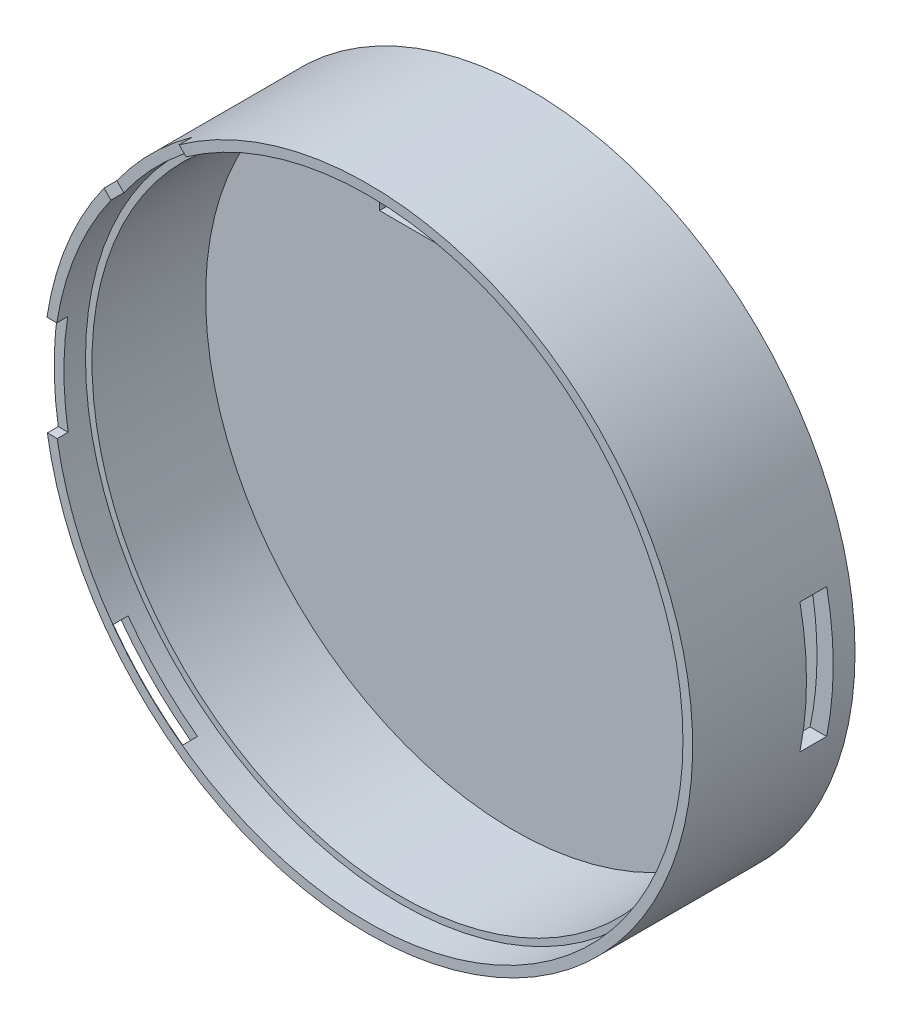
ISO-10303-21;
HEADER;
FILE_DESCRIPTION(('STEP AP214'),'2;1');
FILE_NAME('part.step','',(''),(''),'','','');
FILE_SCHEMA(('AUTOMOTIVE_DESIGN { 1 0 10303 214 1 1 1 1 }'));
ENDSEC;
DATA;
#1=APPLICATION_CONTEXT('core data for automotive mechanical design processes');
#2=APPLICATION_PROTOCOL_DEFINITION('international standard','automotive_design',2000,#1);
#3=PRODUCT_CONTEXT('',#1,'mechanical');
#4=PRODUCT('Part','Part','',(#3));
#5=PRODUCT_RELATED_PRODUCT_CATEGORY('part','',(#4));
#6=PRODUCT_DEFINITION_FORMATION('','',#4);
#7=PRODUCT_DEFINITION_CONTEXT('part definition',#1,'design');
#8=PRODUCT_DEFINITION('design','',#6,#7);
#9=PRODUCT_DEFINITION_SHAPE('','',#8);
#10=(LENGTH_UNIT() NAMED_UNIT(*) SI_UNIT(.MILLI.,.METRE.));
#11=(NAMED_UNIT(*) PLANE_ANGLE_UNIT() SI_UNIT($,.RADIAN.));
#12=(NAMED_UNIT(*) SI_UNIT($,.STERADIAN.) SOLID_ANGLE_UNIT());
#13=UNCERTAINTY_MEASURE_WITH_UNIT(LENGTH_MEASURE(1.E-05),#10,'distance_accuracy_value','');
#14=(GEOMETRIC_REPRESENTATION_CONTEXT(3) GLOBAL_UNCERTAINTY_ASSIGNED_CONTEXT((#13)) GLOBAL_UNIT_ASSIGNED_CONTEXT((#10,
#11,#12)) REPRESENTATION_CONTEXT('',''));
#15=CARTESIAN_POINT('',(0.,0.,0.));
#16=DIRECTION('',(0.,0.,1.));
#17=DIRECTION('',(1.,0.,0.));
#18=AXIS2_PLACEMENT_3D('',#15,#16,#17);
#19=CARTESIAN_POINT('',(0.,0.,50.));
#20=DIRECTION('',(0.,0.,-1.));
#21=DIRECTION('',(-1.,0.,0.));
#22=AXIS2_PLACEMENT_3D('',#19,#20,#21);
#23=CYLINDRICAL_SURFACE('',#22,100.);
#24=CARTESIAN_POINT('',(0.,0.,14.9644798276611));
#25=DIRECTION('',(0.,0.,-1.));
#26=DIRECTION('',(-1.,0.,0.));
#27=AXIS2_PLACEMENT_3D('',#24,#25,#26);
#28=CIRCLE('',#27,100.);
#29=CARTESIAN_POINT('',(97.9865057482183,19.9660885316675,14.9644798276611));
#30=VERTEX_POINT('',#29);
#31=CARTESIAN_POINT('',(97.9708719019762,-20.0426609702049,14.9644798276611));
#32=VERTEX_POINT('',#31);
#33=EDGE_CURVE('E277',#30,#32,#28,.T.);
#34=ORIENTED_EDGE('',*,*,#33,.F.);
#35=DIRECTION('',(0.,0.,-1.));
#36=VECTOR('',#35,1.);
#37=CARTESIAN_POINT('',(97.9865057482183,19.9660885316675,50.));
#38=LINE('',#37,#36);
#39=CARTESIAN_POINT('',(97.9865057482183,19.9660885316675,6.71855520469222));
#40=VERTEX_POINT('',#39);
#41=EDGE_CURVE('E273',#30,#40,#38,.T.);
#42=ORIENTED_EDGE('',*,*,#41,.T.);
#43=CARTESIAN_POINT('',(0.,0.,6.71855520469222));
#44=DIRECTION('',(0.,0.,-1.));
#45=DIRECTION('',(-1.,0.,0.));
#46=AXIS2_PLACEMENT_3D('',#43,#44,#45);
#47=CIRCLE('',#46,100.);
#48=CARTESIAN_POINT('',(97.9708719019762,-20.0426609702049,6.71855520469222));
#49=VERTEX_POINT('',#48);
#50=EDGE_CURVE('E270',#40,#49,#47,.T.);
#51=ORIENTED_EDGE('',*,*,#50,.T.);
#52=DIRECTION('',(0.,0.,-1.));
#53=VECTOR('',#52,1.);
#54=CARTESIAN_POINT('',(97.9708719019762,-20.0426609702049,50.));
#55=LINE('',#54,#53);
#56=EDGE_CURVE('E255',#32,#49,#55,.T.);
#57=ORIENTED_EDGE('',*,*,#56,.F.);
#58=EDGE_LOOP('',(#34,#42,#51,#57));
#59=FACE_BOUND('',#58,.T.);
#60=CARTESIAN_POINT('',(0.,0.,0.));
#61=DIRECTION('',(0.,0.,1.));
#62=DIRECTION('',(1.,0.,0.));
#63=AXIS2_PLACEMENT_3D('',#60,#61,#62);
#64=CIRCLE('',#63,100.);
#65=CARTESIAN_POINT('',(100.,0.,0.));
#66=VERTEX_POINT('',#65);
#67=EDGE_CURVE('E347',#66,#66,#64,.T.);
#68=ORIENTED_EDGE('',*,*,#67,.T.);
#69=EDGE_LOOP('',(#68));
#70=FACE_BOUND('',#69,.T.);
#71=CARTESIAN_POINT('',(0.,0.,49.8726882058378));
#72=DIRECTION('',(0.,0.,-1.));
#73=DIRECTION('',(-1.,0.,0.));
#74=AXIS2_PLACEMENT_3D('',#71,#72,#73);
#75=CIRCLE('',#74,100.);
#76=CARTESIAN_POINT('',(-59.3502952348447,-80.4831811966747,49.8726882058378));
#77=VERTEX_POINT('',#76);
#78=CARTESIAN_POINT('',(-80.7322004401331,-59.0111160044799,49.8726882058378));
#79=VERTEX_POINT('',#78);
#80=EDGE_CURVE('E70',#77,#79,#75,.T.);
#81=ORIENTED_EDGE('',*,*,#80,.F.);
#82=DIRECTION('',(0.,0.,-1.));
#83=VECTOR('',#82,1.);
#84=CARTESIAN_POINT('',(-59.3502952348447,-80.4831811966747,50.));
#85=LINE('',#84,#83);
#86=CARTESIAN_POINT('',(-59.3502952348447,-80.4831811966747,45.2895893373437));
#87=VERTEX_POINT('',#86);
#88=EDGE_CURVE('E245',#87,#77,#85,.F.);
#89=ORIENTED_EDGE('',*,*,#88,.F.);
#90=CARTESIAN_POINT('',(0.,0.,45.2895893373437));
#91=DIRECTION('',(0.,0.,-1.));
#92=DIRECTION('',(-1.,0.,0.));
#93=AXIS2_PLACEMENT_3D('',#90,#91,#92);
#94=CIRCLE('',#93,100.);
#95=CARTESIAN_POINT('',(-80.7322004401331,-59.0111160044799,45.2895893373437));
#96=VERTEX_POINT('',#95);
#97=EDGE_CURVE('E242',#87,#96,#94,.T.);
#98=ORIENTED_EDGE('',*,*,#97,.T.);
#99=DIRECTION('',(0.,0.,-1.));
#100=VECTOR('',#99,1.);
#101=CARTESIAN_POINT('',(-80.7322004401331,-59.0111160044799,50.));
#102=LINE('',#101,#100);
#103=EDGE_CURVE('E228',#96,#79,#102,.F.);
#104=ORIENTED_EDGE('',*,*,#103,.T.);
#105=EDGE_LOOP('',(#81,#89,#98,#104));
#106=FACE_BOUND('',#105,.T.);
#107=CARTESIAN_POINT('',(0.,0.,46.0432568562226));
#108=DIRECTION('',(0.,0.,1.));
#109=DIRECTION('',(1.,0.,0.));
#110=AXIS2_PLACEMENT_3D('',#107,#108,#109);
#111=CIRCLE('',#110,100.);
#112=CARTESIAN_POINT('',(-58.1556657037433,81.3505903270189,46.0432568562226));
#113=VERTEX_POINT('',#112);
#114=CARTESIAN_POINT('',(-81.2978235060901,58.229407460257,46.0432568562226));
#115=VERTEX_POINT('',#114);
#116=EDGE_CURVE('E200',#113,#115,#111,.T.);
#117=ORIENTED_EDGE('',*,*,#116,.F.);
#118=DIRECTION('',(0.,0.,-1.));
#119=VECTOR('',#118,1.);
#120=CARTESIAN_POINT('',(-58.1556657037433,81.3505903270189,50.));
#121=LINE('',#120,#119);
#122=CARTESIAN_POINT('',(-58.1556657037433,81.3505903270189,50.));
#123=VERTEX_POINT('',#122);
#124=EDGE_CURVE('E214',#113,#123,#121,.F.);
#125=ORIENTED_EDGE('',*,*,#124,.T.);
#126=CARTESIAN_POINT('',(0.,0.,50.));
#127=DIRECTION('',(0.,0.,1.));
#128=DIRECTION('',(1.,0.,0.));
#129=AXIS2_PLACEMENT_3D('',#126,#127,#128);
#130=CIRCLE('',#129,100.);
#131=CARTESIAN_POINT('',(-98.7449536162256,-15.7934839516005,50.));
#132=VERTEX_POINT('',#131);
#133=EDGE_CURVE('E348',#132,#123,#130,.T.);
#134=ORIENTED_EDGE('',*,*,#133,.F.);
#135=DIRECTION('',(0.,0.,-1.));
#136=VECTOR('',#135,1.);
#137=CARTESIAN_POINT('',(-98.7449536162256,-15.7934839516005,50.));
#138=LINE('',#137,#136);
#139=CARTESIAN_POINT('',(-98.7449536162256,-15.7934839516005,46.6356465074584));
#140=VERTEX_POINT('',#139);
#141=EDGE_CURVE('E292',#140,#132,#138,.F.);
#142=ORIENTED_EDGE('',*,*,#141,.F.);
#143=CARTESIAN_POINT('',(0.,0.,46.6356465074584));
#144=DIRECTION('',(0.,0.,1.));
#145=DIRECTION('',(1.,0.,0.));
#146=AXIS2_PLACEMENT_3D('',#143,#144,#145);
#147=CIRCLE('',#146,100.);
#148=CARTESIAN_POINT('',(-98.868599666426,15.,46.6356465074584));
#149=VERTEX_POINT('',#148);
#150=EDGE_CURVE('E303',#149,#140,#147,.T.);
#151=ORIENTED_EDGE('',*,*,#150,.F.);
#152=DIRECTION('',(0.,0.,-1.));
#153=VECTOR('',#152,1.);
#154=CARTESIAN_POINT('',(-98.868599666426,15.,50.));
#155=LINE('',#154,#153);
#156=CARTESIAN_POINT('',(-98.868599666426,15.,50.));
#157=VERTEX_POINT('',#156);
#158=EDGE_CURVE('E299',#149,#157,#155,.F.);
#159=ORIENTED_EDGE('',*,*,#158,.T.);
#160=CARTESIAN_POINT('',(-81.2978235060901,58.229407460257,50.));
#161=VERTEX_POINT('',#160);
#162=EDGE_CURVE('E353',#161,#157,#130,.T.);
#163=ORIENTED_EDGE('',*,*,#162,.F.);
#164=DIRECTION('',(0.,0.,-1.));
#165=VECTOR('',#164,1.);
#166=CARTESIAN_POINT('',(-81.2978235060901,58.229407460257,50.));
#167=LINE('',#166,#165);
#168=EDGE_CURVE('E62',#115,#161,#167,.F.);
#169=ORIENTED_EDGE('',*,*,#168,.F.);
#170=EDGE_LOOP('',(#117,#125,#134,#142,#151,#159,#163,#169));
#171=FACE_BOUND('',#170,.T.);
#172=ADVANCED_FACE('F47',(#59,#70,#106,#171),#23,.T.);
#173=CARTESIAN_POINT('',(0.,0.,50.));
#174=DIRECTION('',(0.,0.,1.));
#175=DIRECTION('',(1.,0.,0.));
#176=AXIS2_PLACEMENT_3D('',#173,#174,#175);
#177=PLANE('',#176);
#178=CARTESIAN_POINT('',(0.,0.,50.));
#179=DIRECTION('',(0.,0.,1.));
#180=DIRECTION('',(1.,0.,0.));
#181=AXIS2_PLACEMENT_3D('',#178,#179,#180);
#182=CIRCLE('',#181,97.);
#183=CARTESIAN_POINT('',(-79.1467959432446,56.0783798974115,50.));
#184=VERTEX_POINT('',#183);
#185=CARTESIAN_POINT('',(-95.8331884056875,15.,50.));
#186=VERTEX_POINT('',#185);
#187=EDGE_CURVE('E306',#184,#186,#182,.T.);
#188=ORIENTED_EDGE('',*,*,#187,.F.);
#189=DIRECTION('',(-0.707106781186549,0.707106781186546,0.));
#190=VECTOR('',#189,1.);
#191=CARTESIAN_POINT('',(-11.5342080229164,-11.5342080229164,50.));
#192=LINE('',#191,#190);
#193=EDGE_CURVE('E188',#184,#161,#192,.T.);
#194=ORIENTED_EDGE('',*,*,#193,.T.);
#195=ORIENTED_EDGE('',*,*,#162,.T.);
#196=DIRECTION('',(-1.,0.,0.));
#197=VECTOR('',#196,1.);
#198=CARTESIAN_POINT('',(0.,15.,50.));
#199=LINE('',#198,#197);
#200=EDGE_CURVE('E295',#186,#157,#199,.T.);
#201=ORIENTED_EDGE('',*,*,#200,.F.);
#202=EDGE_LOOP('',(#188,#194,#195,#201));
#203=FACE_BOUND('',#202,.T.);
#204=ADVANCED_FACE('F437',(#203),#177,.T.);
#205=CARTESIAN_POINT('',(0.,0.,40.));
#206=DIRECTION('',(0.,0.,1.));
#207=DIRECTION('',(1.,0.,0.));
#208=AXIS2_PLACEMENT_3D('',#205,#206,#207);
#209=CYLINDRICAL_SURFACE('',#208,97.);
#210=CARTESIAN_POINT('',(-95.7056208624684,-15.7934839516005,50.));
#211=VERTEX_POINT('',#210);
#212=CARTESIAN_POINT('',(-56.0043044399061,79.1992290631817,50.));
#213=VERTEX_POINT('',#212);
#214=EDGE_CURVE('E210',#211,#213,#182,.T.);
#215=ORIENTED_EDGE('',*,*,#214,.T.);
#216=DIRECTION('',(0.,0.,1.));
#217=VECTOR('',#216,1.);
#218=CARTESIAN_POINT('',(-56.0043044399061,79.1992290631817,40.));
#219=LINE('',#218,#217);
#220=CARTESIAN_POINT('',(-56.0043044399061,79.1992290631817,46.0432568562226));
#221=VERTEX_POINT('',#220);
#222=EDGE_CURVE('E207',#213,#221,#219,.F.);
#223=ORIENTED_EDGE('',*,*,#222,.T.);
#224=CARTESIAN_POINT('',(0.,0.,46.0432568562226));
#225=DIRECTION('',(0.,0.,1.));
#226=DIRECTION('',(1.,0.,0.));
#227=AXIS2_PLACEMENT_3D('',#224,#225,#226);
#228=CIRCLE('',#227,97.);
#229=CARTESIAN_POINT('',(-79.1467959432446,56.0783798974115,46.0432568562226));
#230=VERTEX_POINT('',#229);
#231=EDGE_CURVE('E11',#230,#221,#228,.F.);
#232=ORIENTED_EDGE('',*,*,#231,.F.);
#233=DIRECTION('',(0.,0.,1.));
#234=VECTOR('',#233,1.);
#235=CARTESIAN_POINT('',(-79.1467959432446,56.0783798974115,40.));
#236=LINE('',#235,#234);
#237=EDGE_CURVE('E184',#184,#230,#236,.F.);
#238=ORIENTED_EDGE('',*,*,#237,.F.);
#239=ORIENTED_EDGE('',*,*,#187,.T.);
#240=DIRECTION('',(0.,0.,1.));
#241=VECTOR('',#240,1.);
#242=CARTESIAN_POINT('',(-95.8331884056875,15.,40.));
#243=LINE('',#242,#241);
#244=CARTESIAN_POINT('',(-95.8331884056875,15.,46.6356465074584));
#245=VERTEX_POINT('',#244);
#246=EDGE_CURVE('E380',#186,#245,#243,.F.);
#247=ORIENTED_EDGE('',*,*,#246,.T.);
#248=CARTESIAN_POINT('',(0.,0.,46.6356465074584));
#249=DIRECTION('',(0.,0.,1.));
#250=DIRECTION('',(1.,0.,0.));
#251=AXIS2_PLACEMENT_3D('',#248,#249,#250);
#252=CIRCLE('',#251,97.);
#253=CARTESIAN_POINT('',(-95.7056208624684,-15.7934839516005,46.6356465074584));
#254=VERTEX_POINT('',#253);
#255=EDGE_CURVE('E377',#254,#245,#252,.F.);
#256=ORIENTED_EDGE('',*,*,#255,.F.);
#257=DIRECTION('',(0.,0.,1.));
#258=VECTOR('',#257,1.);
#259=CARTESIAN_POINT('',(-95.7056208624684,-15.7934839516005,40.));
#260=LINE('',#259,#258);
#261=EDGE_CURVE('E371',#211,#254,#260,.F.);
#262=ORIENTED_EDGE('',*,*,#261,.F.);
#263=EDGE_LOOP('',(#215,#223,#232,#238,#239,#247,#256,#262));
#264=FACE_BOUND('',#263,.T.);
#265=CARTESIAN_POINT('',(0.,0.,40.));
#266=DIRECTION('',(0.,0.,1.));
#267=DIRECTION('',(1.,0.,0.));
#268=AXIS2_PLACEMENT_3D('',#265,#266,#267);
#269=CIRCLE('',#268,97.);
#270=CARTESIAN_POINT('',(97.,0.,40.));
#271=VERTEX_POINT('',#270);
#272=EDGE_CURVE('E307',#271,#271,#269,.T.);
#273=ORIENTED_EDGE('',*,*,#272,.F.);
#274=EDGE_LOOP('',(#273));
#275=FACE_BOUND('',#274,.T.);
#276=CARTESIAN_POINT('',(0.,0.,49.8726882058378));
#277=DIRECTION('',(0.,0.,-1.));
#278=DIRECTION('',(-1.,0.,0.));
#279=AXIS2_PLACEMENT_3D('',#276,#277,#278);
#280=CIRCLE('',#279,97.);
#281=CARTESIAN_POINT('',(-78.5846045792562,-56.863520143603,49.8726882058378));
#282=VERTEX_POINT('',#281);
#283=CARTESIAN_POINT('',(-57.2041279384087,-78.3370139002386,49.8726882058378));
#284=VERTEX_POINT('',#283);
#285=EDGE_CURVE('E410',#282,#284,#280,.F.);
#286=ORIENTED_EDGE('',*,*,#285,.F.);
#287=DIRECTION('',(0.,0.,1.));
#288=VECTOR('',#287,1.);
#289=CARTESIAN_POINT('',(-78.5846045792562,-56.863520143603,40.));
#290=LINE('',#289,#288);
#291=CARTESIAN_POINT('',(-78.5846045792562,-56.863520143603,45.2895893373437));
#292=VERTEX_POINT('',#291);
#293=EDGE_CURVE('E399',#282,#292,#290,.F.);
#294=ORIENTED_EDGE('',*,*,#293,.T.);
#295=CARTESIAN_POINT('',(0.,0.,45.2895893373437));
#296=DIRECTION('',(0.,0.,-1.));
#297=DIRECTION('',(-1.,0.,0.));
#298=AXIS2_PLACEMENT_3D('',#295,#296,#297);
#299=CIRCLE('',#298,97.);
#300=CARTESIAN_POINT('',(-57.2041279384087,-78.3370139002386,45.2895893373437));
#301=VERTEX_POINT('',#300);
#302=EDGE_CURVE('E403',#292,#301,#299,.F.);
#303=ORIENTED_EDGE('',*,*,#302,.T.);
#304=DIRECTION('',(0.,0.,1.));
#305=VECTOR('',#304,1.);
#306=CARTESIAN_POINT('',(-57.2041279384087,-78.3370139002386,40.));
#307=LINE('',#306,#305);
#308=EDGE_CURVE('E407',#284,#301,#307,.F.);
#309=ORIENTED_EDGE('',*,*,#308,.F.);
#310=EDGE_LOOP('',(#286,#294,#303,#309));
#311=FACE_BOUND('',#310,.T.);
#312=ADVANCED_FACE('F205',(#264,#275,#311),#209,.F.);
#313=CARTESIAN_POINT('',(0.,0.,50.));
#314=DIRECTION('',(0.,0.,-1.));
#315=DIRECTION('',(-1.,0.,0.));
#316=AXIS2_PLACEMENT_3D('',#313,#314,#315);
#317=CYLINDRICAL_SURFACE('',#316,95.);
#318=CARTESIAN_POINT('',(0.,0.,5.));
#319=DIRECTION('',(0.,0.,1.));
#320=DIRECTION('',(1.,0.,0.));
#321=AXIS2_PLACEMENT_3D('',#318,#319,#320);
#322=CIRCLE('',#321,95.);
#323=CARTESIAN_POINT('',(95.,0.,5.));
#324=VERTEX_POINT('',#323);
#325=EDGE_CURVE('E343',#324,#324,#322,.T.);
#326=ORIENTED_EDGE('',*,*,#325,.F.);
#327=EDGE_LOOP('',(#326));
#328=FACE_BOUND('',#327,.T.);
#329=CARTESIAN_POINT('',(0.,0.,40.));
#330=DIRECTION('',(0.,0.,1.));
#331=DIRECTION('',(1.,0.,0.));
#332=AXIS2_PLACEMENT_3D('',#329,#330,#331);
#333=CIRCLE('',#332,95.);
#334=CARTESIAN_POINT('',(95.,0.,40.));
#335=VERTEX_POINT('',#334);
#336=EDGE_CURVE('E311',#335,#335,#333,.T.);
#337=ORIENTED_EDGE('',*,*,#336,.T.);
#338=EDGE_LOOP('',(#337));
#339=FACE_BOUND('',#338,.T.);
#340=DIRECTION('',(0.,0.,-1.));
#341=VECTOR('',#340,1.);
#342=CARTESIAN_POINT('',(92.8781745554122,19.9660885316675,50.));
#343=LINE('',#342,#341);
#344=CARTESIAN_POINT('',(92.8781745554122,19.9660885316675,14.9644798276611));
#345=VERTEX_POINT('',#344);
#346=CARTESIAN_POINT('',(92.8781745554122,19.9660885316675,6.71855520469222));
#347=VERTEX_POINT('',#346);
#348=EDGE_CURVE('E392',#345,#347,#343,.T.);
#349=ORIENTED_EDGE('',*,*,#348,.F.);
#350=CARTESIAN_POINT('',(0.,0.,14.9644798276611));
#351=DIRECTION('',(0.,0.,-1.));
#352=DIRECTION('',(-1.,0.,0.));
#353=AXIS2_PLACEMENT_3D('',#350,#351,#352);
#354=CIRCLE('',#353,95.);
#355=CARTESIAN_POINT('',(92.8616806935639,-20.0426609702049,14.9644798276611));
#356=VERTEX_POINT('',#355);
#357=EDGE_CURVE('E395',#345,#356,#354,.T.);
#358=ORIENTED_EDGE('',*,*,#357,.T.);
#359=DIRECTION('',(0.,0.,-1.));
#360=VECTOR('',#359,1.);
#361=CARTESIAN_POINT('',(92.8616806935639,-20.0426609702049,50.));
#362=LINE('',#361,#360);
#363=CARTESIAN_POINT('',(92.8616806935639,-20.0426609702049,6.71855520469222));
#364=VERTEX_POINT('',#363);
#365=EDGE_CURVE('E384',#356,#364,#362,.T.);
#366=ORIENTED_EDGE('',*,*,#365,.T.);
#367=CARTESIAN_POINT('',(0.,0.,6.71855520469222));
#368=DIRECTION('',(0.,0.,-1.));
#369=DIRECTION('',(-1.,0.,0.));
#370=AXIS2_PLACEMENT_3D('',#367,#368,#369);
#371=CIRCLE('',#370,95.);
#372=EDGE_CURVE('E388',#347,#364,#371,.T.);
#373=ORIENTED_EDGE('',*,*,#372,.F.);
#374=EDGE_LOOP('',(#349,#358,#366,#373));
#375=FACE_BOUND('',#374,.T.);
#376=ADVANCED_FACE('F444',(#328,#339,#375),#317,.F.);
#377=CARTESIAN_POINT('',(0.,0.,0.));
#378=DIRECTION('',(0.,0.,1.));
#379=DIRECTION('',(1.,0.,0.));
#380=AXIS2_PLACEMENT_3D('',#377,#378,#379);
#381=PLANE('',#380);
#382=ORIENTED_EDGE('',*,*,#67,.F.);
#383=EDGE_LOOP('',(#382));
#384=FACE_BOUND('',#383,.T.);
#385=DIRECTION('',(0.,-1.,0.));
#386=VECTOR('',#385,1.);
#387=CARTESIAN_POINT('',(-41.4569510919159,0.,0.));
#388=LINE('',#387,#386);
#389=CARTESIAN_POINT('',(-41.4569510919159,56.3791309667369,0.));
#390=VERTEX_POINT('',#389);
#391=CARTESIAN_POINT('',(-41.4569510919159,49.6438279882184,0.));
#392=VERTEX_POINT('',#391);
#393=EDGE_CURVE('E314',#390,#392,#388,.T.);
#394=ORIENTED_EDGE('',*,*,#393,.T.);
#395=DIRECTION('',(1.,0.,0.));
#396=VECTOR('',#395,1.);
#397=CARTESIAN_POINT('',(0.,49.6438279882184,0.));
#398=LINE('',#397,#396);
#399=CARTESIAN_POINT('',(41.4569510919159,49.6438279882184,0.));
#400=VERTEX_POINT('',#399);
#401=EDGE_CURVE('E318',#392,#400,#398,.T.);
#402=ORIENTED_EDGE('',*,*,#401,.T.);
#403=DIRECTION('',(0.,-1.,0.));
#404=VECTOR('',#403,1.);
#405=CARTESIAN_POINT('',(41.4569510919159,0.,0.));
#406=LINE('',#405,#404);
#407=CARTESIAN_POINT('',(41.4569510919159,56.3791309667369,0.));
#408=VERTEX_POINT('',#407);
#409=EDGE_CURVE('E322',#408,#400,#406,.T.);
#410=ORIENTED_EDGE('',*,*,#409,.F.);
#411=DIRECTION('',(1.,0.,0.));
#412=VECTOR('',#411,1.);
#413=CARTESIAN_POINT('',(0.,56.3791309667369,0.));
#414=LINE('',#413,#412);
#415=EDGE_CURVE('E326',#390,#408,#414,.T.);
#416=ORIENTED_EDGE('',*,*,#415,.F.);
#417=EDGE_LOOP('',(#394,#402,#410,#416));
#418=FACE_BOUND('',#417,.T.);
#419=ADVANCED_FACE('F459',(#384,#418),#381,.F.);
#420=CARTESIAN_POINT('',(0.,0.,5.));
#421=DIRECTION('',(0.,0.,1.));
#422=DIRECTION('',(1.,0.,0.));
#423=AXIS2_PLACEMENT_3D('',#420,#421,#422);
#424=PLANE('',#423);
#425=ORIENTED_EDGE('',*,*,#325,.T.);
#426=EDGE_LOOP('',(#425));
#427=FACE_BOUND('',#426,.T.);
#428=DIRECTION('',(-1.,0.,0.));
#429=VECTOR('',#428,1.);
#430=CARTESIAN_POINT('',(0.,49.6438279882184,5.));
#431=LINE('',#430,#429);
#432=CARTESIAN_POINT('',(41.4569510919159,49.6438279882184,5.));
#433=VERTEX_POINT('',#432);
#434=CARTESIAN_POINT('',(-41.4569510919159,49.6438279882184,5.));
#435=VERTEX_POINT('',#434);
#436=EDGE_CURVE('E363',#433,#435,#431,.T.);
#437=ORIENTED_EDGE('',*,*,#436,.T.);
#438=DIRECTION('',(0.,1.,0.));
#439=VECTOR('',#438,1.);
#440=CARTESIAN_POINT('',(-41.4569510919159,0.,5.));
#441=LINE('',#440,#439);
#442=CARTESIAN_POINT('',(-41.4569510919159,56.3791309667369,5.));
#443=VERTEX_POINT('',#442);
#444=EDGE_CURVE('E367',#435,#443,#441,.T.);
#445=ORIENTED_EDGE('',*,*,#444,.T.);
#446=DIRECTION('',(-1.,0.,0.));
#447=VECTOR('',#446,1.);
#448=CARTESIAN_POINT('',(0.,56.3791309667369,5.));
#449=LINE('',#448,#447);
#450=CARTESIAN_POINT('',(41.4569510919159,56.3791309667369,5.));
#451=VERTEX_POINT('',#450);
#452=EDGE_CURVE('E352',#451,#443,#449,.T.);
#453=ORIENTED_EDGE('',*,*,#452,.F.);
#454=DIRECTION('',(0.,1.,0.));
#455=VECTOR('',#454,1.);
#456=CARTESIAN_POINT('',(41.4569510919159,0.,5.));
#457=LINE('',#456,#455);
#458=EDGE_CURVE('E359',#433,#451,#457,.T.);
#459=ORIENTED_EDGE('',*,*,#458,.F.);
#460=EDGE_LOOP('',(#437,#445,#453,#459));
#461=FACE_BOUND('',#460,.T.);
#462=ADVANCED_FACE('F450',(#427,#461),#424,.T.);
#463=DIRECTION('',(-0.707106781186549,0.707106781186546,0.));
#464=VECTOR('',#463,1.);
#465=CARTESIAN_POINT('',(11.5974623116379,11.5974623116379,50.));
#466=LINE('',#465,#464);
#467=EDGE_CURVE('E55',#213,#123,#466,.T.);
#468=ORIENTED_EDGE('',*,*,#467,.F.);
#469=ORIENTED_EDGE('',*,*,#214,.F.);
#470=DIRECTION('',(-1.,0.,0.));
#471=VECTOR('',#470,1.);
#472=CARTESIAN_POINT('',(0.,-15.7934839516005,50.));
#473=LINE('',#472,#471);
#474=EDGE_CURVE('E285',#211,#132,#473,.T.);
#475=ORIENTED_EDGE('',*,*,#474,.T.);
#476=ORIENTED_EDGE('',*,*,#133,.T.);
#477=EDGE_LOOP('',(#468,#469,#475,#476));
#478=FACE_BOUND('',#477,.T.);
#479=ADVANCED_FACE('F420',(#478),#177,.T.);
#480=CARTESIAN_POINT('',(-41.4569510919159,0.,10.));
#481=DIRECTION('',(1.,0.,0.));
#482=DIRECTION('',(0.,0.,-1.));
#483=AXIS2_PLACEMENT_3D('',#480,#481,#482);
#484=PLANE('',#483);
#485=DIRECTION('',(0.,0.,-1.));
#486=VECTOR('',#485,1.);
#487=CARTESIAN_POINT('',(-41.4569510919159,49.6438279882184,10.));
#488=LINE('',#487,#486);
#489=EDGE_CURVE('E340',#435,#392,#488,.T.);
#490=ORIENTED_EDGE('',*,*,#489,.T.);
#491=ORIENTED_EDGE('',*,*,#393,.F.);
#492=DIRECTION('',(0.,0.,-1.));
#493=VECTOR('',#492,1.);
#494=CARTESIAN_POINT('',(-41.4569510919159,56.3791309667369,10.));
#495=LINE('',#494,#493);
#496=EDGE_CURVE('E330',#443,#390,#495,.T.);
#497=ORIENTED_EDGE('',*,*,#496,.F.);
#498=ORIENTED_EDGE('',*,*,#444,.F.);
#499=EDGE_LOOP('',(#490,#491,#497,#498));
#500=FACE_BOUND('',#499,.T.);
#501=ADVANCED_FACE('F449',(#500),#484,.T.);
#502=CARTESIAN_POINT('',(0.,49.6438279882184,10.));
#503=DIRECTION('',(0.,1.,0.));
#504=DIRECTION('',(0.,0.,1.));
#505=AXIS2_PLACEMENT_3D('',#502,#503,#504);
#506=PLANE('',#505);
#507=DIRECTION('',(0.,0.,-1.));
#508=VECTOR('',#507,1.);
#509=CARTESIAN_POINT('',(41.4569510919159,49.6438279882184,10.));
#510=LINE('',#509,#508);
#511=EDGE_CURVE('E337',#433,#400,#510,.T.);
#512=ORIENTED_EDGE('',*,*,#511,.T.);
#513=ORIENTED_EDGE('',*,*,#401,.F.);
#514=ORIENTED_EDGE('',*,*,#489,.F.);
#515=ORIENTED_EDGE('',*,*,#436,.F.);
#516=EDGE_LOOP('',(#512,#513,#514,#515));
#517=FACE_BOUND('',#516,.T.);
#518=ADVANCED_FACE('F455',(#517),#506,.T.);
#519=CARTESIAN_POINT('',(41.4569510919159,0.,10.));
#520=DIRECTION('',(1.,0.,0.));
#521=DIRECTION('',(0.,0.,-1.));
#522=AXIS2_PLACEMENT_3D('',#519,#520,#521);
#523=PLANE('',#522);
#524=ORIENTED_EDGE('',*,*,#458,.T.);
#525=DIRECTION('',(0.,0.,-1.));
#526=VECTOR('',#525,1.);
#527=CARTESIAN_POINT('',(41.4569510919159,56.3791309667369,10.));
#528=LINE('',#527,#526);
#529=EDGE_CURVE('E334',#451,#408,#528,.T.);
#530=ORIENTED_EDGE('',*,*,#529,.T.);
#531=ORIENTED_EDGE('',*,*,#409,.T.);
#532=ORIENTED_EDGE('',*,*,#511,.F.);
#533=EDGE_LOOP('',(#524,#530,#531,#532));
#534=FACE_BOUND('',#533,.T.);
#535=ADVANCED_FACE('F472',(#534),#523,.F.);
#536=CARTESIAN_POINT('',(0.,56.3791309667369,10.));
#537=DIRECTION('',(0.,1.,0.));
#538=DIRECTION('',(0.,0.,1.));
#539=AXIS2_PLACEMENT_3D('',#536,#537,#538);
#540=PLANE('',#539);
#541=ORIENTED_EDGE('',*,*,#452,.T.);
#542=ORIENTED_EDGE('',*,*,#496,.T.);
#543=ORIENTED_EDGE('',*,*,#415,.T.);
#544=ORIENTED_EDGE('',*,*,#529,.F.);
#545=EDGE_LOOP('',(#541,#542,#543,#544));
#546=FACE_BOUND('',#545,.T.);
#547=ADVANCED_FACE('F476',(#546),#540,.F.);
#548=CARTESIAN_POINT('',(0.,0.,40.));
#549=DIRECTION('',(0.,0.,1.));
#550=DIRECTION('',(1.,0.,0.));
#551=AXIS2_PLACEMENT_3D('',#548,#549,#550);
#552=PLANE('',#551);
#553=ORIENTED_EDGE('',*,*,#336,.F.);
#554=EDGE_LOOP('',(#553));
#555=FACE_BOUND('',#554,.T.);
#556=ORIENTED_EDGE('',*,*,#272,.T.);
#557=EDGE_LOOP('',(#556));
#558=FACE_BOUND('',#557,.T.);
#559=ADVANCED_FACE('F479',(#555,#558),#552,.T.);
#560=CARTESIAN_POINT('',(-90.,0.,46.6356465074584));
#561=DIRECTION('',(0.,0.,1.));
#562=DIRECTION('',(1.,0.,0.));
#563=AXIS2_PLACEMENT_3D('',#560,#561,#562);
#564=PLANE('',#563);
#565=ORIENTED_EDGE('',*,*,#150,.T.);
#566=DIRECTION('',(-1.,0.,0.));
#567=VECTOR('',#566,1.);
#568=CARTESIAN_POINT('',(-90.,-15.7934839516005,46.6356465074584));
#569=LINE('',#568,#567);
#570=EDGE_CURVE('E280',#254,#140,#569,.T.);
#571=ORIENTED_EDGE('',*,*,#570,.F.);
#572=ORIENTED_EDGE('',*,*,#255,.T.);
#573=DIRECTION('',(-1.,0.,0.));
#574=VECTOR('',#573,1.);
#575=CARTESIAN_POINT('',(-90.,15.,46.6356465074584));
#576=LINE('',#575,#574);
#577=EDGE_CURVE('E281',#245,#149,#576,.T.);
#578=ORIENTED_EDGE('',*,*,#577,.T.);
#579=EDGE_LOOP('',(#565,#571,#572,#578));
#580=FACE_BOUND('',#579,.T.);
#581=ADVANCED_FACE('F428',(#580),#564,.T.);
#582=CARTESIAN_POINT('',(-90.,15.,0.));
#583=DIRECTION('',(0.,1.,0.));
#584=DIRECTION('',(0.,0.,1.));
#585=AXIS2_PLACEMENT_3D('',#582,#583,#584);
#586=PLANE('',#585);
#587=ORIENTED_EDGE('',*,*,#577,.F.);
#588=ORIENTED_EDGE('',*,*,#246,.F.);
#589=ORIENTED_EDGE('',*,*,#200,.T.);
#590=ORIENTED_EDGE('',*,*,#158,.F.);
#591=EDGE_LOOP('',(#587,#588,#589,#590));
#592=FACE_BOUND('',#591,.T.);
#593=ADVANCED_FACE('F431',(#592),#586,.F.);
#594=CARTESIAN_POINT('',(-90.,-15.7934839516005,0.));
#595=DIRECTION('',(0.,1.,0.));
#596=DIRECTION('',(0.,0.,1.));
#597=AXIS2_PLACEMENT_3D('',#594,#595,#596);
#598=PLANE('',#597);
#599=ORIENTED_EDGE('',*,*,#141,.T.);
#600=ORIENTED_EDGE('',*,*,#474,.F.);
#601=ORIENTED_EDGE('',*,*,#261,.T.);
#602=ORIENTED_EDGE('',*,*,#570,.T.);
#603=EDGE_LOOP('',(#599,#600,#601,#602));
#604=FACE_BOUND('',#603,.T.);
#605=ADVANCED_FACE('F422',(#604),#598,.T.);
#606=CARTESIAN_POINT('',(90.,0.,14.9644798276611));
#607=DIRECTION('',(0.,0.,-1.));
#608=DIRECTION('',(-1.,0.,0.));
#609=AXIS2_PLACEMENT_3D('',#606,#607,#608);
#610=PLANE('',#609);
#611=ORIENTED_EDGE('',*,*,#33,.T.);
#612=DIRECTION('',(1.,0.,0.));
#613=VECTOR('',#612,1.);
#614=CARTESIAN_POINT('',(90.,-20.0426609702049,14.9644798276611));
#615=LINE('',#614,#613);
#616=EDGE_CURVE('E250',#356,#32,#615,.T.);
#617=ORIENTED_EDGE('',*,*,#616,.F.);
#618=ORIENTED_EDGE('',*,*,#357,.F.);
#619=DIRECTION('',(1.,0.,0.));
#620=VECTOR('',#619,1.);
#621=CARTESIAN_POINT('',(90.,19.9660885316675,14.9644798276611));
#622=LINE('',#621,#620);
#623=EDGE_CURVE('E251',#345,#30,#622,.T.);
#624=ORIENTED_EDGE('',*,*,#623,.T.);
#625=EDGE_LOOP('',(#611,#617,#618,#624));
#626=FACE_BOUND('',#625,.T.);
#627=ADVANCED_FACE('F489',(#626),#610,.T.);
#628=CARTESIAN_POINT('',(90.,19.9660885316675,0.));
#629=DIRECTION('',(0.,1.,0.));
#630=DIRECTION('',(0.,0.,1.));
#631=AXIS2_PLACEMENT_3D('',#628,#629,#630);
#632=PLANE('',#631);
#633=ORIENTED_EDGE('',*,*,#623,.F.);
#634=ORIENTED_EDGE('',*,*,#348,.T.);
#635=DIRECTION('',(1.,0.,0.));
#636=VECTOR('',#635,1.);
#637=CARTESIAN_POINT('',(90.,19.9660885316675,6.71855520469222));
#638=LINE('',#637,#636);
#639=EDGE_CURVE('E256',#347,#40,#638,.T.);
#640=ORIENTED_EDGE('',*,*,#639,.T.);
#641=ORIENTED_EDGE('',*,*,#41,.F.);
#642=EDGE_LOOP('',(#633,#634,#640,#641));
#643=FACE_BOUND('',#642,.T.);
#644=ADVANCED_FACE('F494',(#643),#632,.F.);
#645=CARTESIAN_POINT('',(90.,0.,6.71855520469222));
#646=DIRECTION('',(0.,0.,-1.));
#647=DIRECTION('',(-1.,0.,0.));
#648=AXIS2_PLACEMENT_3D('',#645,#646,#647);
#649=PLANE('',#648);
#650=ORIENTED_EDGE('',*,*,#639,.F.);
#651=ORIENTED_EDGE('',*,*,#372,.T.);
#652=DIRECTION('',(1.,0.,0.));
#653=VECTOR('',#652,1.);
#654=CARTESIAN_POINT('',(90.,-20.0426609702049,6.71855520469222));
#655=LINE('',#654,#653);
#656=EDGE_CURVE('E260',#364,#49,#655,.T.);
#657=ORIENTED_EDGE('',*,*,#656,.T.);
#658=ORIENTED_EDGE('',*,*,#50,.F.);
#659=EDGE_LOOP('',(#650,#651,#657,#658));
#660=FACE_BOUND('',#659,.T.);
#661=ADVANCED_FACE('F500',(#660),#649,.F.);
#662=CARTESIAN_POINT('',(90.,-20.0426609702049,0.));
#663=DIRECTION('',(0.,1.,0.));
#664=DIRECTION('',(0.,0.,1.));
#665=AXIS2_PLACEMENT_3D('',#662,#663,#664);
#666=PLANE('',#665);
#667=ORIENTED_EDGE('',*,*,#56,.T.);
#668=ORIENTED_EDGE('',*,*,#656,.F.);
#669=ORIENTED_EDGE('',*,*,#365,.F.);
#670=ORIENTED_EDGE('',*,*,#616,.T.);
#671=EDGE_LOOP('',(#667,#668,#669,#670));
#672=FACE_BOUND('',#671,.T.);
#673=ADVANCED_FACE('F496',(#672),#666,.T.);
#674=CARTESIAN_POINT('',(-63.6396103067892,-63.6396103067894,49.8726882058378));
#675=DIRECTION('',(0.,0.,-1.));
#676=DIRECTION('',(-1.,0.,0.));
#677=AXIS2_PLACEMENT_3D('',#674,#675,#676);
#678=PLANE('',#677);
#679=ORIENTED_EDGE('',*,*,#80,.T.);
#680=DIRECTION('',(-0.707106781186546,-0.707106781186549,0.));
#681=VECTOR('',#680,1.);
#682=CARTESIAN_POINT('',(-74.5001525246159,-52.7790680889627,49.8726882058378));
#683=LINE('',#682,#681);
#684=EDGE_CURVE('E224',#282,#79,#683,.T.);
#685=ORIENTED_EDGE('',*,*,#684,.F.);
#686=ORIENTED_EDGE('',*,*,#285,.T.);
#687=DIRECTION('',(-0.707106781186546,-0.707106781186549,0.));
#688=VECTOR('',#687,1.);
#689=CARTESIAN_POINT('',(-53.0731673258743,-74.2060532877043,49.8726882058378));
#690=LINE('',#689,#688);
#691=EDGE_CURVE('E225',#284,#77,#690,.T.);
#692=ORIENTED_EDGE('',*,*,#691,.T.);
#693=EDGE_LOOP('',(#679,#685,#686,#692));
#694=FACE_BOUND('',#693,.T.);
#695=ADVANCED_FACE('F499',(#694),#678,.T.);
#696=CARTESIAN_POINT('',(-53.0731673258743,-74.2060532877042,0.));
#697=DIRECTION('',(-0.707106781186549,0.707106781186546,0.));
#698=DIRECTION('',(-0.707106781186546,-0.707106781186549,0.));
#699=AXIS2_PLACEMENT_3D('',#696,#697,#698);
#700=PLANE('',#699);
#701=ORIENTED_EDGE('',*,*,#88,.T.);
#702=ORIENTED_EDGE('',*,*,#691,.F.);
#703=ORIENTED_EDGE('',*,*,#308,.T.);
#704=DIRECTION('',(-0.707106781186546,-0.707106781186549,0.));
#705=VECTOR('',#704,1.);
#706=CARTESIAN_POINT('',(-53.0731673258743,-74.2060532877043,45.2895893373437));
#707=LINE('',#706,#705);
#708=EDGE_CURVE('E229',#301,#87,#707,.T.);
#709=ORIENTED_EDGE('',*,*,#708,.T.);
#710=EDGE_LOOP('',(#701,#702,#703,#709));
#711=FACE_BOUND('',#710,.T.);
#712=ADVANCED_FACE('F510',(#711),#700,.T.);
#713=CARTESIAN_POINT('',(-63.6396103067892,-63.6396103067894,45.2895893373437));
#714=DIRECTION('',(0.,0.,-1.));
#715=DIRECTION('',(-1.,0.,0.));
#716=AXIS2_PLACEMENT_3D('',#713,#714,#715);
#717=PLANE('',#716);
#718=ORIENTED_EDGE('',*,*,#708,.F.);
#719=ORIENTED_EDGE('',*,*,#302,.F.);
#720=DIRECTION('',(-0.707106781186546,-0.707106781186549,0.));
#721=VECTOR('',#720,1.);
#722=CARTESIAN_POINT('',(-74.5001525246159,-52.7790680889627,45.2895893373437));
#723=LINE('',#722,#721);
#724=EDGE_CURVE('E233',#292,#96,#723,.T.);
#725=ORIENTED_EDGE('',*,*,#724,.T.);
#726=ORIENTED_EDGE('',*,*,#97,.F.);
#727=EDGE_LOOP('',(#718,#719,#725,#726));
#728=FACE_BOUND('',#727,.T.);
#729=ADVANCED_FACE('F514',(#728),#717,.F.);
#730=CARTESIAN_POINT('',(-74.5001525246159,-52.7790680889627,0.));
#731=DIRECTION('',(-0.707106781186549,0.707106781186546,0.));
#732=DIRECTION('',(-0.707106781186546,-0.707106781186549,0.));
#733=AXIS2_PLACEMENT_3D('',#730,#731,#732);
#734=PLANE('',#733);
#735=ORIENTED_EDGE('',*,*,#724,.F.);
#736=ORIENTED_EDGE('',*,*,#293,.F.);
#737=ORIENTED_EDGE('',*,*,#684,.T.);
#738=ORIENTED_EDGE('',*,*,#103,.F.);
#739=EDGE_LOOP('',(#735,#736,#737,#738));
#740=FACE_BOUND('',#739,.T.);
#741=ADVANCED_FACE('F511',(#740),#734,.F.);
#742=CARTESIAN_POINT('',(-63.6396103067894,63.6396103067892,46.0432568562226));
#743=DIRECTION('',(0.,0.,1.));
#744=DIRECTION('',(1.,0.,0.));
#745=AXIS2_PLACEMENT_3D('',#742,#743,#744);
#746=PLANE('',#745);
#747=ORIENTED_EDGE('',*,*,#116,.T.);
#748=DIRECTION('',(-0.707106781186549,0.707106781186546,0.));
#749=VECTOR('',#748,1.);
#750=CARTESIAN_POINT('',(-75.1738183297058,52.1054022838728,46.0432568562226));
#751=LINE('',#750,#749);
#752=EDGE_CURVE('E187',#230,#115,#751,.T.);
#753=ORIENTED_EDGE('',*,*,#752,.F.);
#754=ORIENTED_EDGE('',*,*,#231,.T.);
#755=DIRECTION('',(-0.707106781186549,0.707106781186546,0.));
#756=VECTOR('',#755,1.);
#757=CARTESIAN_POINT('',(-52.0421479951515,75.2370726184271,46.0432568562226));
#758=LINE('',#757,#756);
#759=EDGE_CURVE('E193',#221,#113,#758,.T.);
#760=ORIENTED_EDGE('',*,*,#759,.T.);
#761=EDGE_LOOP('',(#747,#753,#754,#760));
#762=FACE_BOUND('',#761,.T.);
#763=ADVANCED_FACE('F196',(#762),#746,.T.);
#764=CARTESIAN_POINT('',(-52.0421479951515,75.2370726184271,0.));
#765=DIRECTION('',(0.707106781186546,0.707106781186549,0.));
#766=DIRECTION('',(-0.707106781186549,0.707106781186546,0.));
#767=AXIS2_PLACEMENT_3D('',#764,#765,#766);
#768=PLANE('',#767);
#769=ORIENTED_EDGE('',*,*,#759,.F.);
#770=ORIENTED_EDGE('',*,*,#222,.F.);
#771=ORIENTED_EDGE('',*,*,#467,.T.);
#772=ORIENTED_EDGE('',*,*,#124,.F.);
#773=EDGE_LOOP('',(#769,#770,#771,#772));
#774=FACE_BOUND('',#773,.T.);
#775=ADVANCED_FACE('F415',(#774),#768,.F.);
#776=CARTESIAN_POINT('',(-75.1738183297058,52.1054022838728,0.));
#777=DIRECTION('',(0.707106781186546,0.707106781186549,0.));
#778=DIRECTION('',(-0.707106781186549,0.707106781186546,0.));
#779=AXIS2_PLACEMENT_3D('',#776,#777,#778);
#780=PLANE('',#779);
#781=ORIENTED_EDGE('',*,*,#168,.T.);
#782=ORIENTED_EDGE('',*,*,#193,.F.);
#783=ORIENTED_EDGE('',*,*,#237,.T.);
#784=ORIENTED_EDGE('',*,*,#752,.T.);
#785=EDGE_LOOP('',(#781,#782,#783,#784));
#786=FACE_BOUND('',#785,.T.);
#787=ADVANCED_FACE('F186',(#786),#780,.T.);
#788=CLOSED_SHELL('',(#172,#204,#312,#376,#419,#462,#479,#501,#518,#535,#547,#559,#581,#593,
#605,#627,#644,#661,#673,#695,#712,#729,#741,#763,#775,#787));
#789=MANIFOLD_SOLID_BREP('B2',#788);
#790=ADVANCED_BREP_SHAPE_REPRESENTATION('',(#18,#789),#14);
#791=SHAPE_DEFINITION_REPRESENTATION(#9,#790);
ENDSEC;
END-ISO-10303-21;
